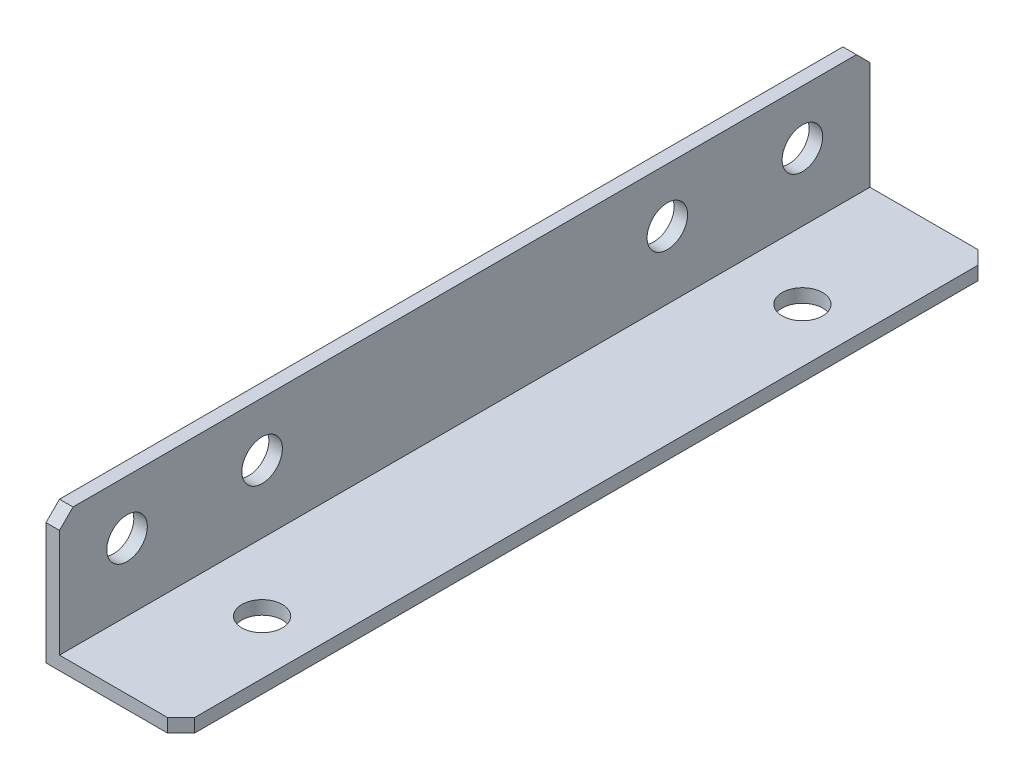
ISO-10303-21;
HEADER;
FILE_DESCRIPTION(('STEP AP214'),'2;1');
FILE_NAME('part.step','',(''),(''),'','','');
FILE_SCHEMA(('AUTOMOTIVE_DESIGN { 1 0 10303 214 1 1 1 1 }'));
ENDSEC;
DATA;
#1=APPLICATION_CONTEXT('core data for automotive mechanical design processes');
#2=APPLICATION_PROTOCOL_DEFINITION('international standard','automotive_design',2000,#1);
#3=PRODUCT_CONTEXT('',#1,'mechanical');
#4=PRODUCT('Part','Part','',(#3));
#5=PRODUCT_RELATED_PRODUCT_CATEGORY('part','',(#4));
#6=PRODUCT_DEFINITION_FORMATION('','',#4);
#7=PRODUCT_DEFINITION_CONTEXT('part definition',#1,'design');
#8=PRODUCT_DEFINITION('design','',#6,#7);
#9=PRODUCT_DEFINITION_SHAPE('','',#8);
#10=(LENGTH_UNIT() NAMED_UNIT(*) SI_UNIT(.MILLI.,.METRE.));
#11=(NAMED_UNIT(*) PLANE_ANGLE_UNIT() SI_UNIT($,.RADIAN.));
#12=(NAMED_UNIT(*) SI_UNIT($,.STERADIAN.) SOLID_ANGLE_UNIT());
#13=UNCERTAINTY_MEASURE_WITH_UNIT(LENGTH_MEASURE(1.E-05),#10,'distance_accuracy_value','');
#14=(GEOMETRIC_REPRESENTATION_CONTEXT(3) GLOBAL_UNCERTAINTY_ASSIGNED_CONTEXT((#13)) GLOBAL_UNIT_ASSIGNED_CONTEXT((#10,
#11,#12)) REPRESENTATION_CONTEXT('',''));
#15=CARTESIAN_POINT('',(0.,0.,0.));
#16=DIRECTION('',(0.,0.,1.));
#17=DIRECTION('',(1.,0.,0.));
#18=AXIS2_PLACEMENT_3D('',#15,#16,#17);
#19=CARTESIAN_POINT('',(0.,0.,30.));
#20=DIRECTION('',(0.,1.,0.));
#21=DIRECTION('',(0.,0.,1.));
#22=AXIS2_PLACEMENT_3D('',#19,#20,#21);
#23=PLANE('',#22);
#24=CARTESIAN_POINT('',(6.,0.,-20.));
#25=DIRECTION('',(0.,1.,0.));
#26=DIRECTION('',(0.,0.,1.));
#27=AXIS2_PLACEMENT_3D('',#24,#25,#26);
#28=CIRCLE('',#27,1.5);
#29=CARTESIAN_POINT('',(6.,0.,-18.5));
#30=VERTEX_POINT('',#29);
#31=EDGE_CURVE('E317',#30,#30,#28,.T.);
#32=ORIENTED_EDGE('',*,*,#31,.T.);
#33=EDGE_LOOP('',(#32));
#34=FACE_BOUND('',#33,.T.);
#35=CARTESIAN_POINT('',(6.,0.,20.));
#36=DIRECTION('',(0.,1.,0.));
#37=DIRECTION('',(0.,0.,1.));
#38=AXIS2_PLACEMENT_3D('',#35,#36,#37);
#39=CIRCLE('',#38,1.5);
#40=CARTESIAN_POINT('',(6.,0.,21.5));
#41=VERTEX_POINT('',#40);
#42=EDGE_CURVE('E321',#41,#41,#39,.T.);
#43=ORIENTED_EDGE('',*,*,#42,.T.);
#44=EDGE_LOOP('',(#43));
#45=FACE_BOUND('',#44,.T.);
#46=DIRECTION('',(1.,0.,0.));
#47=VECTOR('',#46,1.);
#48=CARTESIAN_POINT('',(0.,0.,-30.));
#49=LINE('',#48,#47);
#50=CARTESIAN_POINT('',(0.,0.,-30.));
#51=VERTEX_POINT('',#50);
#52=CARTESIAN_POINT('',(8.99999999999999,0.,-30.));
#53=VERTEX_POINT('',#52);
#54=EDGE_CURVE('E145',#51,#53,#49,.T.);
#55=ORIENTED_EDGE('',*,*,#54,.T.);
#56=DIRECTION('',(-0.707106781186545,0.,-0.70710678118655));
#57=VECTOR('',#56,1.);
#58=CARTESIAN_POINT('',(8.99999999999999,0.,-30.));
#59=LINE('',#58,#57);
#60=CARTESIAN_POINT('',(10.,0.,-29.));
#61=VERTEX_POINT('',#60);
#62=EDGE_CURVE('E183',#53,#61,#59,.F.);
#63=ORIENTED_EDGE('',*,*,#62,.T.);
#64=DIRECTION('',(0.,0.,-1.));
#65=VECTOR('',#64,1.);
#66=CARTESIAN_POINT('',(10.,0.,30.));
#67=LINE('',#66,#65);
#68=CARTESIAN_POINT('',(10.,0.,29.));
#69=VERTEX_POINT('',#68);
#70=EDGE_CURVE('E161',#69,#61,#67,.T.);
#71=ORIENTED_EDGE('',*,*,#70,.F.);
#72=DIRECTION('',(-0.70710678118655,0.,0.707106781186545));
#73=VECTOR('',#72,1.);
#74=CARTESIAN_POINT('',(10.,0.,29.));
#75=LINE('',#74,#73);
#76=CARTESIAN_POINT('',(8.99999999999999,0.,30.));
#77=VERTEX_POINT('',#76);
#78=EDGE_CURVE('E181',#69,#77,#75,.T.);
#79=ORIENTED_EDGE('',*,*,#78,.T.);
#80=DIRECTION('',(1.,0.,0.));
#81=VECTOR('',#80,1.);
#82=CARTESIAN_POINT('',(0.,0.,30.));
#83=LINE('',#82,#81);
#84=CARTESIAN_POINT('',(0.,0.,30.));
#85=VERTEX_POINT('',#84);
#86=EDGE_CURVE('E137',#85,#77,#83,.T.);
#87=ORIENTED_EDGE('',*,*,#86,.F.);
#88=DIRECTION('',(0.,0.,-1.));
#89=VECTOR('',#88,1.);
#90=CARTESIAN_POINT('',(0.,0.,30.));
#91=LINE('',#90,#89);
#92=EDGE_CURVE('E144',#85,#51,#91,.T.);
#93=ORIENTED_EDGE('',*,*,#92,.T.);
#94=EDGE_LOOP('',(#55,#63,#71,#79,#87,#93));
#95=FACE_BOUND('',#94,.T.);
#96=ADVANCED_FACE('F35',(#34,#45,#95),#23,.F.);
#97=CARTESIAN_POINT('',(10.,1.,30.));
#98=DIRECTION('',(1.,0.,0.));
#99=DIRECTION('',(0.,0.,-1.));
#100=AXIS2_PLACEMENT_3D('',#97,#98,#99);
#101=PLANE('',#100);
#102=ORIENTED_EDGE('',*,*,#70,.T.);
#103=DIRECTION('',(0.,1.,0.));
#104=VECTOR('',#103,1.);
#105=CARTESIAN_POINT('',(10.,1.,-29.));
#106=LINE('',#105,#104);
#107=CARTESIAN_POINT('',(10.,1.,-29.));
#108=VERTEX_POINT('',#107);
#109=EDGE_CURVE('E58',#61,#108,#106,.T.);
#110=ORIENTED_EDGE('',*,*,#109,.T.);
#111=DIRECTION('',(0.,0.,-1.));
#112=VECTOR('',#111,1.);
#113=CARTESIAN_POINT('',(10.,1.,30.));
#114=LINE('',#113,#112);
#115=CARTESIAN_POINT('',(10.,1.,29.));
#116=VERTEX_POINT('',#115);
#117=EDGE_CURVE('E133',#116,#108,#114,.T.);
#118=ORIENTED_EDGE('',*,*,#117,.F.);
#119=DIRECTION('',(0.,-1.,0.));
#120=VECTOR('',#119,1.);
#121=CARTESIAN_POINT('',(10.,0.,29.));
#122=LINE('',#121,#120);
#123=EDGE_CURVE('E185',#116,#69,#122,.T.);
#124=ORIENTED_EDGE('',*,*,#123,.T.);
#125=EDGE_LOOP('',(#102,#110,#118,#124));
#126=FACE_BOUND('',#125,.T.);
#127=ADVANCED_FACE('F232',(#126),#101,.T.);
#128=CARTESIAN_POINT('',(0.,1.,30.));
#129=DIRECTION('',(0.,1.,0.));
#130=DIRECTION('',(0.,0.,1.));
#131=AXIS2_PLACEMENT_3D('',#128,#129,#130);
#132=PLANE('',#131);
#133=CARTESIAN_POINT('',(6.,1.,-20.));
#134=DIRECTION('',(0.,1.,0.));
#135=DIRECTION('',(0.,0.,1.));
#136=AXIS2_PLACEMENT_3D('',#133,#134,#135);
#137=CIRCLE('',#136,1.5);
#138=CARTESIAN_POINT('',(6.,1.,-18.5));
#139=VERTEX_POINT('',#138);
#140=EDGE_CURVE('E315',#139,#139,#137,.T.);
#141=ORIENTED_EDGE('',*,*,#140,.F.);
#142=EDGE_LOOP('',(#141));
#143=FACE_BOUND('',#142,.T.);
#144=CARTESIAN_POINT('',(6.,1.,20.));
#145=DIRECTION('',(0.,1.,0.));
#146=DIRECTION('',(0.,0.,1.));
#147=AXIS2_PLACEMENT_3D('',#144,#145,#146);
#148=CIRCLE('',#147,1.5);
#149=CARTESIAN_POINT('',(6.,1.,21.5));
#150=VERTEX_POINT('',#149);
#151=EDGE_CURVE('E318',#150,#150,#148,.T.);
#152=ORIENTED_EDGE('',*,*,#151,.F.);
#153=EDGE_LOOP('',(#152));
#154=FACE_BOUND('',#153,.T.);
#155=ORIENTED_EDGE('',*,*,#117,.T.);
#156=DIRECTION('',(0.707106781186545,0.,0.70710678118655));
#157=VECTOR('',#156,1.);
#158=CARTESIAN_POINT('',(34.5,1.,-4.49999999999979));
#159=LINE('',#158,#157);
#160=CARTESIAN_POINT('',(8.99999999999998,1.,-30.));
#161=VERTEX_POINT('',#160);
#162=EDGE_CURVE('E191',#108,#161,#159,.F.);
#163=ORIENTED_EDGE('',*,*,#162,.T.);
#164=DIRECTION('',(1.,0.,0.));
#165=VECTOR('',#164,1.);
#166=CARTESIAN_POINT('',(0.,1.,-30.));
#167=LINE('',#166,#165);
#168=CARTESIAN_POINT('',(1.,1.,-30.));
#169=VERTEX_POINT('',#168);
#170=EDGE_CURVE('E132',#169,#161,#167,.T.);
#171=ORIENTED_EDGE('',*,*,#170,.F.);
#172=DIRECTION('',(0.,0.,-1.));
#173=VECTOR('',#172,1.);
#174=CARTESIAN_POINT('',(1.,1.,30.));
#175=LINE('',#174,#173);
#176=CARTESIAN_POINT('',(1.,1.,30.));
#177=VERTEX_POINT('',#176);
#178=EDGE_CURVE('E120',#177,#169,#175,.T.);
#179=ORIENTED_EDGE('',*,*,#178,.F.);
#180=DIRECTION('',(1.,0.,0.));
#181=VECTOR('',#180,1.);
#182=CARTESIAN_POINT('',(0.,1.,30.));
#183=LINE('',#182,#181);
#184=CARTESIAN_POINT('',(8.99999999999999,1.,30.));
#185=VERTEX_POINT('',#184);
#186=EDGE_CURVE('E126',#177,#185,#183,.T.);
#187=ORIENTED_EDGE('',*,*,#186,.T.);
#188=DIRECTION('',(0.70710678118655,0.,-0.707106781186545));
#189=VECTOR('',#188,1.);
#190=CARTESIAN_POINT('',(4.49999999999997,1.,34.5));
#191=LINE('',#190,#189);
#192=EDGE_CURVE('E189',#185,#116,#191,.T.);
#193=ORIENTED_EDGE('',*,*,#192,.T.);
#194=EDGE_LOOP('',(#155,#163,#171,#179,#187,#193));
#195=FACE_BOUND('',#194,.T.);
#196=ADVANCED_FACE('F129',(#143,#154,#195),#132,.T.);
#197=CARTESIAN_POINT('',(1.,10.,30.));
#198=DIRECTION('',(1.,0.,0.));
#199=DIRECTION('',(0.,1.,0.));
#200=AXIS2_PLACEMENT_3D('',#197,#198,#199);
#201=PLANE('',#200);
#202=CARTESIAN_POINT('',(1.,6.,-25.));
#203=DIRECTION('',(1.,0.,0.));
#204=DIRECTION('',(0.,1.,0.));
#205=AXIS2_PLACEMENT_3D('',#202,#203,#204);
#206=CIRCLE('',#205,1.5);
#207=CARTESIAN_POINT('',(1.,7.5,-25.));
#208=VERTEX_POINT('',#207);
#209=EDGE_CURVE('E212',#208,#208,#206,.T.);
#210=ORIENTED_EDGE('',*,*,#209,.F.);
#211=EDGE_LOOP('',(#210));
#212=FACE_BOUND('',#211,.T.);
#213=CARTESIAN_POINT('',(1.,6.,25.));
#214=DIRECTION('',(1.,0.,0.));
#215=DIRECTION('',(0.,1.,0.));
#216=AXIS2_PLACEMENT_3D('',#213,#214,#215);
#217=CIRCLE('',#216,1.5);
#218=CARTESIAN_POINT('',(1.,7.5,25.));
#219=VERTEX_POINT('',#218);
#220=EDGE_CURVE('E202',#219,#219,#217,.T.);
#221=ORIENTED_EDGE('',*,*,#220,.F.);
#222=EDGE_LOOP('',(#221));
#223=FACE_BOUND('',#222,.T.);
#224=CARTESIAN_POINT('',(1.,6.,-15.));
#225=DIRECTION('',(1.,0.,0.));
#226=DIRECTION('',(0.,1.,0.));
#227=AXIS2_PLACEMENT_3D('',#224,#225,#226);
#228=CIRCLE('',#227,1.5);
#229=CARTESIAN_POINT('',(1.,7.5,-15.));
#230=VERTEX_POINT('',#229);
#231=EDGE_CURVE('E199',#230,#230,#228,.T.);
#232=ORIENTED_EDGE('',*,*,#231,.F.);
#233=EDGE_LOOP('',(#232));
#234=FACE_BOUND('',#233,.T.);
#235=CARTESIAN_POINT('',(1.,6.,15.));
#236=DIRECTION('',(1.,0.,0.));
#237=DIRECTION('',(0.,1.,0.));
#238=AXIS2_PLACEMENT_3D('',#235,#236,#237);
#239=CIRCLE('',#238,1.5);
#240=CARTESIAN_POINT('',(1.,7.5,15.));
#241=VERTEX_POINT('',#240);
#242=EDGE_CURVE('E196',#241,#241,#239,.T.);
#243=ORIENTED_EDGE('',*,*,#242,.F.);
#244=EDGE_LOOP('',(#243));
#245=FACE_BOUND('',#244,.T.);
#246=DIRECTION('',(0.,-1.,0.));
#247=VECTOR('',#246,1.);
#248=CARTESIAN_POINT('',(1.,10.,-30.));
#249=LINE('',#248,#247);
#250=CARTESIAN_POINT('',(1.,8.99999999999999,-30.));
#251=VERTEX_POINT('',#250);
#252=EDGE_CURVE('E150',#251,#169,#249,.T.);
#253=ORIENTED_EDGE('',*,*,#252,.F.);
#254=DIRECTION('',(0.,-0.707106781186545,-0.70710678118655));
#255=VECTOR('',#254,1.);
#256=CARTESIAN_POINT('',(1.00000000000001,39.5,0.500000000000212));
#257=LINE('',#256,#255);
#258=CARTESIAN_POINT('',(1.,10.,-29.));
#259=VERTEX_POINT('',#258);
#260=EDGE_CURVE('E170',#251,#259,#257,.F.);
#261=ORIENTED_EDGE('',*,*,#260,.T.);
#262=DIRECTION('',(0.,0.,-1.));
#263=VECTOR('',#262,1.);
#264=CARTESIAN_POINT('',(1.,10.,30.));
#265=LINE('',#264,#263);
#266=CARTESIAN_POINT('',(1.,10.,29.));
#267=VERTEX_POINT('',#266);
#268=EDGE_CURVE('E134',#267,#259,#265,.T.);
#269=ORIENTED_EDGE('',*,*,#268,.F.);
#270=DIRECTION('',(0.,-0.70710678118655,0.707106781186545));
#271=VECTOR('',#270,1.);
#272=CARTESIAN_POINT('',(1.,9.5,29.5));
#273=LINE('',#272,#271);
#274=CARTESIAN_POINT('',(1.,8.99999999999999,30.));
#275=VERTEX_POINT('',#274);
#276=EDGE_CURVE('E123',#267,#275,#273,.T.);
#277=ORIENTED_EDGE('',*,*,#276,.T.);
#278=DIRECTION('',(0.,-1.,0.));
#279=VECTOR('',#278,1.);
#280=CARTESIAN_POINT('',(1.,10.,30.));
#281=LINE('',#280,#279);
#282=EDGE_CURVE('E116',#275,#177,#281,.T.);
#283=ORIENTED_EDGE('',*,*,#282,.T.);
#284=ORIENTED_EDGE('',*,*,#178,.T.);
#285=EDGE_LOOP('',(#253,#261,#269,#277,#283,#284));
#286=FACE_BOUND('',#285,.T.);
#287=ADVANCED_FACE('F119',(#212,#223,#234,#245,#286),#201,.T.);
#288=CARTESIAN_POINT('',(0.,10.,30.));
#289=DIRECTION('',(0.,1.,0.));
#290=DIRECTION('',(0.,0.,1.));
#291=AXIS2_PLACEMENT_3D('',#288,#289,#290);
#292=PLANE('',#291);
#293=ORIENTED_EDGE('',*,*,#268,.T.);
#294=DIRECTION('',(-1.,0.,0.));
#295=VECTOR('',#294,1.);
#296=CARTESIAN_POINT('',(0.,10.,-29.));
#297=LINE('',#296,#295);
#298=CARTESIAN_POINT('',(0.,10.,-29.));
#299=VERTEX_POINT('',#298);
#300=EDGE_CURVE('E175',#259,#299,#297,.T.);
#301=ORIENTED_EDGE('',*,*,#300,.T.);
#302=DIRECTION('',(0.,0.,-1.));
#303=VECTOR('',#302,1.);
#304=CARTESIAN_POINT('',(0.,10.,30.));
#305=LINE('',#304,#303);
#306=CARTESIAN_POINT('',(0.,10.,29.));
#307=VERTEX_POINT('',#306);
#308=EDGE_CURVE('E155',#307,#299,#305,.T.);
#309=ORIENTED_EDGE('',*,*,#308,.F.);
#310=DIRECTION('',(1.,0.,0.));
#311=VECTOR('',#310,1.);
#312=CARTESIAN_POINT('',(1.,10.,29.));
#313=LINE('',#312,#311);
#314=EDGE_CURVE('E172',#307,#267,#313,.T.);
#315=ORIENTED_EDGE('',*,*,#314,.T.);
#316=EDGE_LOOP('',(#293,#301,#309,#315));
#317=FACE_BOUND('',#316,.T.);
#318=ADVANCED_FACE('F222',(#317),#292,.T.);
#319=CARTESIAN_POINT('',(0.,10.,30.));
#320=DIRECTION('',(1.,0.,0.));
#321=DIRECTION('',(0.,1.,0.));
#322=AXIS2_PLACEMENT_3D('',#319,#320,#321);
#323=PLANE('',#322);
#324=CARTESIAN_POINT('',(0.,6.,-25.));
#325=DIRECTION('',(1.,0.,0.));
#326=DIRECTION('',(0.,1.,0.));
#327=AXIS2_PLACEMENT_3D('',#324,#325,#326);
#328=CIRCLE('',#327,1.5);
#329=CARTESIAN_POINT('',(0.,7.5,-25.));
#330=VERTEX_POINT('',#329);
#331=EDGE_CURVE('E39',#330,#330,#328,.T.);
#332=ORIENTED_EDGE('',*,*,#331,.T.);
#333=EDGE_LOOP('',(#332));
#334=FACE_BOUND('',#333,.T.);
#335=CARTESIAN_POINT('',(0.,6.,25.));
#336=DIRECTION('',(1.,0.,0.));
#337=DIRECTION('',(0.,1.,0.));
#338=AXIS2_PLACEMENT_3D('',#335,#336,#337);
#339=CIRCLE('',#338,1.5);
#340=CARTESIAN_POINT('',(0.,7.5,25.));
#341=VERTEX_POINT('',#340);
#342=EDGE_CURVE('E200',#341,#341,#339,.T.);
#343=ORIENTED_EDGE('',*,*,#342,.T.);
#344=EDGE_LOOP('',(#343));
#345=FACE_BOUND('',#344,.T.);
#346=CARTESIAN_POINT('',(0.,6.,-15.));
#347=DIRECTION('',(1.,0.,0.));
#348=DIRECTION('',(0.,1.,0.));
#349=AXIS2_PLACEMENT_3D('',#346,#347,#348);
#350=CIRCLE('',#349,1.5);
#351=CARTESIAN_POINT('',(0.,7.5,-15.));
#352=VERTEX_POINT('',#351);
#353=EDGE_CURVE('E197',#352,#352,#350,.T.);
#354=ORIENTED_EDGE('',*,*,#353,.T.);
#355=EDGE_LOOP('',(#354));
#356=FACE_BOUND('',#355,.T.);
#357=CARTESIAN_POINT('',(0.,6.,15.));
#358=DIRECTION('',(1.,0.,0.));
#359=DIRECTION('',(0.,1.,0.));
#360=AXIS2_PLACEMENT_3D('',#357,#358,#359);
#361=CIRCLE('',#360,1.5);
#362=CARTESIAN_POINT('',(0.,7.5,15.));
#363=VERTEX_POINT('',#362);
#364=EDGE_CURVE('E148',#363,#363,#361,.T.);
#365=ORIENTED_EDGE('',*,*,#364,.T.);
#366=EDGE_LOOP('',(#365));
#367=FACE_BOUND('',#366,.T.);
#368=ORIENTED_EDGE('',*,*,#308,.T.);
#369=DIRECTION('',(0.,0.707106781186545,0.70710678118655));
#370=VECTOR('',#369,1.);
#371=CARTESIAN_POINT('',(0.,9.,-30.));
#372=LINE('',#371,#370);
#373=CARTESIAN_POINT('',(0.,9.,-30.));
#374=VERTEX_POINT('',#373);
#375=EDGE_CURVE('E179',#299,#374,#372,.F.);
#376=ORIENTED_EDGE('',*,*,#375,.T.);
#377=DIRECTION('',(0.,-1.,0.));
#378=VECTOR('',#377,1.);
#379=CARTESIAN_POINT('',(0.,10.,-30.));
#380=LINE('',#379,#378);
#381=EDGE_CURVE('E139',#374,#51,#380,.T.);
#382=ORIENTED_EDGE('',*,*,#381,.T.);
#383=ORIENTED_EDGE('',*,*,#92,.F.);
#384=DIRECTION('',(0.,-1.,0.));
#385=VECTOR('',#384,1.);
#386=CARTESIAN_POINT('',(0.,10.,30.));
#387=LINE('',#386,#385);
#388=CARTESIAN_POINT('',(0.,8.99999999999999,30.));
#389=VERTEX_POINT('',#388);
#390=EDGE_CURVE('E125',#389,#85,#387,.T.);
#391=ORIENTED_EDGE('',*,*,#390,.F.);
#392=DIRECTION('',(0.,0.70710678118655,-0.707106781186545));
#393=VECTOR('',#392,1.);
#394=CARTESIAN_POINT('',(0.,10.,29.));
#395=LINE('',#394,#393);
#396=EDGE_CURVE('E177',#389,#307,#395,.T.);
#397=ORIENTED_EDGE('',*,*,#396,.T.);
#398=EDGE_LOOP('',(#368,#376,#382,#383,#391,#397));
#399=FACE_BOUND('',#398,.T.);
#400=ADVANCED_FACE('F229',(#334,#345,#356,#367,#399),#323,.F.);
#401=CARTESIAN_POINT('',(10.,0.,30.));
#402=DIRECTION('',(0.,0.,-1.));
#403=DIRECTION('',(-1.,0.,0.));
#404=AXIS2_PLACEMENT_3D('',#401,#402,#403);
#405=PLANE('',#404);
#406=ORIENTED_EDGE('',*,*,#86,.T.);
#407=DIRECTION('',(0.,1.,0.));
#408=VECTOR('',#407,1.);
#409=CARTESIAN_POINT('',(8.99999999999999,1.,30.));
#410=LINE('',#409,#408);
#411=EDGE_CURVE('E11',#77,#185,#410,.T.);
#412=ORIENTED_EDGE('',*,*,#411,.T.);
#413=ORIENTED_EDGE('',*,*,#186,.F.);
#414=ORIENTED_EDGE('',*,*,#282,.F.);
#415=DIRECTION('',(-1.,0.,0.));
#416=VECTOR('',#415,1.);
#417=CARTESIAN_POINT('',(0.,8.99999999999999,30.));
#418=LINE('',#417,#416);
#419=EDGE_CURVE('E44',#275,#389,#418,.T.);
#420=ORIENTED_EDGE('',*,*,#419,.T.);
#421=ORIENTED_EDGE('',*,*,#390,.T.);
#422=EDGE_LOOP('',(#406,#412,#413,#414,#420,#421));
#423=FACE_BOUND('',#422,.T.);
#424=ADVANCED_FACE('F136',(#423),#405,.F.);
#425=CARTESIAN_POINT('',(10.,0.,-30.));
#426=DIRECTION('',(0.,0.,-1.));
#427=DIRECTION('',(-1.,0.,0.));
#428=AXIS2_PLACEMENT_3D('',#425,#426,#427);
#429=PLANE('',#428);
#430=ORIENTED_EDGE('',*,*,#381,.F.);
#431=DIRECTION('',(1.,0.,0.));
#432=VECTOR('',#431,1.);
#433=CARTESIAN_POINT('',(10.,8.99999999999999,-30.));
#434=LINE('',#433,#432);
#435=EDGE_CURVE('E166',#374,#251,#434,.T.);
#436=ORIENTED_EDGE('',*,*,#435,.T.);
#437=ORIENTED_EDGE('',*,*,#252,.T.);
#438=ORIENTED_EDGE('',*,*,#170,.T.);
#439=DIRECTION('',(0.,-1.,0.));
#440=VECTOR('',#439,1.);
#441=CARTESIAN_POINT('',(8.99999999999999,0.,-30.));
#442=LINE('',#441,#440);
#443=EDGE_CURVE('E163',#161,#53,#442,.T.);
#444=ORIENTED_EDGE('',*,*,#443,.T.);
#445=ORIENTED_EDGE('',*,*,#54,.F.);
#446=EDGE_LOOP('',(#430,#436,#437,#438,#444,#445));
#447=FACE_BOUND('',#446,.T.);
#448=ADVANCED_FACE('F251',(#447),#429,.T.);
#449=CARTESIAN_POINT('',(10.,8.99999999999999,-30.));
#450=DIRECTION('',(0.,-0.70710678118655,0.707106781186545));
#451=DIRECTION('',(0.,-0.707106781186545,-0.70710678118655));
#452=AXIS2_PLACEMENT_3D('',#449,#450,#451);
#453=PLANE('',#452);
#454=ORIENTED_EDGE('',*,*,#375,.F.);
#455=ORIENTED_EDGE('',*,*,#300,.F.);
#456=ORIENTED_EDGE('',*,*,#260,.F.);
#457=ORIENTED_EDGE('',*,*,#435,.F.);
#458=EDGE_LOOP('',(#454,#455,#456,#457));
#459=FACE_BOUND('',#458,.T.);
#460=ADVANCED_FACE('F247',(#459),#453,.F.);
#461=CARTESIAN_POINT('',(8.99999999999999,0.,-30.));
#462=DIRECTION('',(-0.70710678118655,0.,0.707106781186545));
#463=DIRECTION('',(0.707106781186545,0.,0.70710678118655));
#464=AXIS2_PLACEMENT_3D('',#461,#462,#463);
#465=PLANE('',#464);
#466=ORIENTED_EDGE('',*,*,#162,.F.);
#467=ORIENTED_EDGE('',*,*,#109,.F.);
#468=ORIENTED_EDGE('',*,*,#62,.F.);
#469=ORIENTED_EDGE('',*,*,#443,.F.);
#470=EDGE_LOOP('',(#466,#467,#468,#469));
#471=FACE_BOUND('',#470,.T.);
#472=ADVANCED_FACE('F250',(#471),#465,.F.);
#473=CARTESIAN_POINT('',(10.,1.,29.));
#474=DIRECTION('',(0.707106781186545,0.,0.70710678118655));
#475=DIRECTION('',(0.70710678118655,0.,-0.707106781186545));
#476=AXIS2_PLACEMENT_3D('',#473,#474,#475);
#477=PLANE('',#476);
#478=ORIENTED_EDGE('',*,*,#192,.F.);
#479=ORIENTED_EDGE('',*,*,#411,.F.);
#480=ORIENTED_EDGE('',*,*,#78,.F.);
#481=ORIENTED_EDGE('',*,*,#123,.F.);
#482=EDGE_LOOP('',(#478,#479,#480,#481));
#483=FACE_BOUND('',#482,.T.);
#484=ADVANCED_FACE('F254',(#483),#477,.T.);
#485=CARTESIAN_POINT('',(0.,10.,29.));
#486=DIRECTION('',(0.,0.707106781186545,0.70710678118655));
#487=DIRECTION('',(0.,-0.70710678118655,0.707106781186545));
#488=AXIS2_PLACEMENT_3D('',#485,#486,#487);
#489=PLANE('',#488);
#490=ORIENTED_EDGE('',*,*,#396,.F.);
#491=ORIENTED_EDGE('',*,*,#419,.F.);
#492=ORIENTED_EDGE('',*,*,#276,.F.);
#493=ORIENTED_EDGE('',*,*,#314,.F.);
#494=EDGE_LOOP('',(#490,#491,#492,#493));
#495=FACE_BOUND('',#494,.T.);
#496=ADVANCED_FACE('F37',(#495),#489,.T.);
#497=CARTESIAN_POINT('',(-9.,6.,15.));
#498=DIRECTION('',(1.,0.,0.));
#499=DIRECTION('',(0.,1.,0.));
#500=AXIS2_PLACEMENT_3D('',#497,#498,#499);
#501=CYLINDRICAL_SURFACE('',#500,1.5);
#502=ORIENTED_EDGE('',*,*,#242,.T.);
#503=EDGE_LOOP('',(#502));
#504=FACE_BOUND('',#503,.T.);
#505=ORIENTED_EDGE('',*,*,#364,.F.);
#506=EDGE_LOOP('',(#505));
#507=FACE_BOUND('',#506,.T.);
#508=ADVANCED_FACE('F218',(#504,#507),#501,.F.);
#509=CARTESIAN_POINT('',(-9.,6.,-15.));
#510=DIRECTION('',(1.,0.,0.));
#511=DIRECTION('',(0.,1.,0.));
#512=AXIS2_PLACEMENT_3D('',#509,#510,#511);
#513=CYLINDRICAL_SURFACE('',#512,1.5);
#514=ORIENTED_EDGE('',*,*,#231,.T.);
#515=EDGE_LOOP('',(#514));
#516=FACE_BOUND('',#515,.T.);
#517=ORIENTED_EDGE('',*,*,#353,.F.);
#518=EDGE_LOOP('',(#517));
#519=FACE_BOUND('',#518,.T.);
#520=ADVANCED_FACE('F292',(#516,#519),#513,.F.);
#521=CARTESIAN_POINT('',(-9.,6.,25.));
#522=DIRECTION('',(1.,0.,0.));
#523=DIRECTION('',(0.,1.,0.));
#524=AXIS2_PLACEMENT_3D('',#521,#522,#523);
#525=CYLINDRICAL_SURFACE('',#524,1.5);
#526=ORIENTED_EDGE('',*,*,#220,.T.);
#527=EDGE_LOOP('',(#526));
#528=FACE_BOUND('',#527,.T.);
#529=ORIENTED_EDGE('',*,*,#342,.F.);
#530=EDGE_LOOP('',(#529));
#531=FACE_BOUND('',#530,.T.);
#532=ADVANCED_FACE('F295',(#528,#531),#525,.F.);
#533=CARTESIAN_POINT('',(-9.,6.,-25.));
#534=DIRECTION('',(1.,0.,0.));
#535=DIRECTION('',(0.,1.,0.));
#536=AXIS2_PLACEMENT_3D('',#533,#534,#535);
#537=CYLINDRICAL_SURFACE('',#536,1.5);
#538=ORIENTED_EDGE('',*,*,#209,.T.);
#539=EDGE_LOOP('',(#538));
#540=FACE_BOUND('',#539,.T.);
#541=ORIENTED_EDGE('',*,*,#331,.F.);
#542=EDGE_LOOP('',(#541));
#543=FACE_BOUND('',#542,.T.);
#544=ADVANCED_FACE('F299',(#540,#543),#537,.F.);
#545=CARTESIAN_POINT('',(6.,-9.,20.));
#546=DIRECTION('',(0.,1.,0.));
#547=DIRECTION('',(0.,0.,1.));
#548=AXIS2_PLACEMENT_3D('',#545,#546,#547);
#549=CYLINDRICAL_SURFACE('',#548,1.5);
#550=ORIENTED_EDGE('',*,*,#151,.T.);
#551=EDGE_LOOP('',(#550));
#552=FACE_BOUND('',#551,.T.);
#553=ORIENTED_EDGE('',*,*,#42,.F.);
#554=EDGE_LOOP('',(#553));
#555=FACE_BOUND('',#554,.T.);
#556=ADVANCED_FACE('F302',(#552,#555),#549,.F.);
#557=CARTESIAN_POINT('',(6.,-9.,-20.));
#558=DIRECTION('',(0.,1.,0.));
#559=DIRECTION('',(0.,0.,1.));
#560=AXIS2_PLACEMENT_3D('',#557,#558,#559);
#561=CYLINDRICAL_SURFACE('',#560,1.5);
#562=ORIENTED_EDGE('',*,*,#140,.T.);
#563=EDGE_LOOP('',(#562));
#564=FACE_BOUND('',#563,.T.);
#565=ORIENTED_EDGE('',*,*,#31,.F.);
#566=EDGE_LOOP('',(#565));
#567=FACE_BOUND('',#566,.T.);
#568=ADVANCED_FACE('F306',(#564,#567),#561,.F.);
#569=CLOSED_SHELL('',(#96,#127,#196,#287,#318,#400,#424,#448,#460,#472,#484,#496,#508,#520,#532,
#544,#556,#568));
#570=MANIFOLD_SOLID_BREP('B2',#569);
#571=ADVANCED_BREP_SHAPE_REPRESENTATION('',(#18,#570),#14);
#572=SHAPE_DEFINITION_REPRESENTATION(#9,#571);
ENDSEC;
END-ISO-10303-21;
